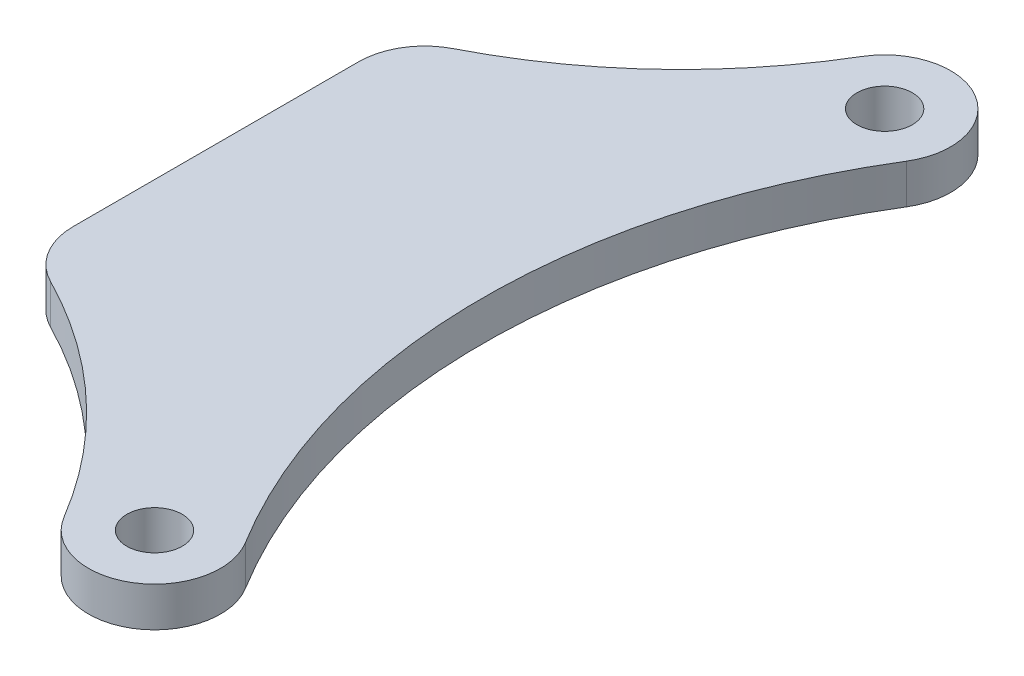
ISO-10303-21;
HEADER;
FILE_DESCRIPTION(('STEP AP214'),'2;1');
FILE_NAME('part.step','',(''),(''),'','','');
FILE_SCHEMA(('AUTOMOTIVE_DESIGN { 1 0 10303 214 1 1 1 1 }'));
ENDSEC;
DATA;
#1=APPLICATION_CONTEXT('core data for automotive mechanical design processes');
#2=APPLICATION_PROTOCOL_DEFINITION('international standard','automotive_design',2000,#1);
#3=PRODUCT_CONTEXT('',#1,'mechanical');
#4=PRODUCT('Part','Part','',(#3));
#5=PRODUCT_RELATED_PRODUCT_CATEGORY('part','',(#4));
#6=PRODUCT_DEFINITION_FORMATION('','',#4);
#7=PRODUCT_DEFINITION_CONTEXT('part definition',#1,'design');
#8=PRODUCT_DEFINITION('design','',#6,#7);
#9=PRODUCT_DEFINITION_SHAPE('','',#8);
#10=(LENGTH_UNIT() NAMED_UNIT(*) SI_UNIT(.MILLI.,.METRE.));
#11=(NAMED_UNIT(*) PLANE_ANGLE_UNIT() SI_UNIT($,.RADIAN.));
#12=(NAMED_UNIT(*) SI_UNIT($,.STERADIAN.) SOLID_ANGLE_UNIT());
#13=UNCERTAINTY_MEASURE_WITH_UNIT(LENGTH_MEASURE(1.E-05),#10,'distance_accuracy_value','');
#14=(GEOMETRIC_REPRESENTATION_CONTEXT(3) GLOBAL_UNCERTAINTY_ASSIGNED_CONTEXT((#13)) GLOBAL_UNIT_ASSIGNED_CONTEXT((#10,
#11,#12)) REPRESENTATION_CONTEXT('',''));
#15=CARTESIAN_POINT('',(0.,0.,0.));
#16=DIRECTION('',(0.,0.,1.));
#17=DIRECTION('',(1.,0.,0.));
#18=AXIS2_PLACEMENT_3D('',#15,#16,#17);
#19=CARTESIAN_POINT('',(-15.081183554011,3.,50.304084356289));
#20=DIRECTION('',(0.,-1.,0.));
#21=DIRECTION('',(0.,0.,-1.));
#22=AXIS2_PLACEMENT_3D('',#19,#20,#21);
#23=CYLINDRICAL_SURFACE('',#22,39.3119401497601);
#24=CARTESIAN_POINT('',(-15.081183554011,3.,50.304084356289));
#25=DIRECTION('',(0.,1.,0.));
#26=DIRECTION('',(0.,0.,1.));
#27=AXIS2_PLACEMENT_3D('',#24,#25,#26);
#28=CIRCLE('',#27,39.3119401497601);
#29=CARTESIAN_POINT('',(18.7030561711687,3.,30.2029952183864));
#30=VERTEX_POINT('',#29);
#31=CARTESIAN_POINT('',(2.73411145098329,3.,15.2606270179591));
#32=VERTEX_POINT('',#31);
#33=EDGE_CURVE('E112',#30,#32,#28,.T.);
#34=ORIENTED_EDGE('',*,*,#33,.T.);
#35=DIRECTION('',(0.,-1.,0.));
#36=VECTOR('',#35,1.);
#37=CARTESIAN_POINT('',(2.73411145098329,3.,15.2606270179591));
#38=LINE('',#37,#36);
#39=CARTESIAN_POINT('',(2.73411145098329,0.,15.2606270179591));
#40=VERTEX_POINT('',#39);
#41=EDGE_CURVE('E11',#32,#40,#38,.T.);
#42=ORIENTED_EDGE('',*,*,#41,.T.);
#43=CARTESIAN_POINT('',(-15.081183554011,0.,50.304084356289));
#44=DIRECTION('',(0.,1.,0.));
#45=DIRECTION('',(0.,0.,1.));
#46=AXIS2_PLACEMENT_3D('',#43,#44,#45);
#47=CIRCLE('',#46,39.3119401497601);
#48=CARTESIAN_POINT('',(18.7030561711687,0.,30.2029952183864));
#49=VERTEX_POINT('',#48);
#50=EDGE_CURVE('E115',#49,#40,#47,.T.);
#51=ORIENTED_EDGE('',*,*,#50,.F.);
#52=DIRECTION('',(0.,-1.,0.));
#53=VECTOR('',#52,1.);
#54=CARTESIAN_POINT('',(18.7030561711687,3.,30.2029952183864));
#55=LINE('',#54,#53);
#56=EDGE_CURVE('E110',#30,#49,#55,.T.);
#57=ORIENTED_EDGE('',*,*,#56,.F.);
#58=EDGE_LOOP('',(#34,#42,#51,#57));
#59=FACE_BOUND('',#58,.T.);
#60=ADVANCED_FACE('F41',(#59),#23,.F.);
#61=CARTESIAN_POINT('',(23.,3.,27.6463814947534));
#62=DIRECTION('',(0.,-1.,0.));
#63=DIRECTION('',(0.,0.,-1.));
#64=AXIS2_PLACEMENT_3D('',#61,#62,#63);
#65=CYLINDRICAL_SURFACE('',#64,4.99999999999999);
#66=CARTESIAN_POINT('',(23.,0.,27.6463814947534));
#67=DIRECTION('',(0.,1.,0.));
#68=DIRECTION('',(0.,0.,1.));
#69=AXIS2_PLACEMENT_3D('',#66,#67,#68);
#70=CIRCLE('',#69,4.99999999999999);
#71=CARTESIAN_POINT('',(27.2602311164125,0.,25.0290487236388));
#72=VERTEX_POINT('',#71);
#73=EDGE_CURVE('E163',#49,#72,#70,.T.);
#74=ORIENTED_EDGE('',*,*,#73,.T.);
#75=DIRECTION('',(0.,-1.,0.));
#76=VECTOR('',#75,1.);
#77=CARTESIAN_POINT('',(27.2602311164125,3.,25.0290487236388));
#78=LINE('',#77,#76);
#79=CARTESIAN_POINT('',(27.2602311164125,3.,25.0290487236388));
#80=VERTEX_POINT('',#79);
#81=EDGE_CURVE('E120',#80,#72,#78,.T.);
#82=ORIENTED_EDGE('',*,*,#81,.F.);
#83=CARTESIAN_POINT('',(23.,3.,27.6463814947534));
#84=DIRECTION('',(0.,1.,0.));
#85=DIRECTION('',(0.,0.,1.));
#86=AXIS2_PLACEMENT_3D('',#83,#84,#85);
#87=CIRCLE('',#86,4.99999999999999);
#88=EDGE_CURVE('E123',#30,#80,#87,.T.);
#89=ORIENTED_EDGE('',*,*,#88,.F.);
#90=ORIENTED_EDGE('',*,*,#56,.T.);
#91=EDGE_LOOP('',(#74,#82,#89,#90));
#92=FACE_BOUND('',#91,.T.);
#93=ADVANCED_FACE('F124',(#92),#65,.T.);
#94=CARTESIAN_POINT('',(68.,3.,0.));
#95=DIRECTION('',(0.,-1.,0.));
#96=DIRECTION('',(0.,0.,-1.));
#97=AXIS2_PLACEMENT_3D('',#94,#95,#96);
#98=CYLINDRICAL_SURFACE('',#97,47.8140361055037);
#99=CARTESIAN_POINT('',(68.,0.,0.));
#100=DIRECTION('',(0.,1.,0.));
#101=DIRECTION('',(0.,0.,1.));
#102=AXIS2_PLACEMENT_3D('',#99,#100,#101);
#103=CIRCLE('',#102,47.8140361055037);
#104=CARTESIAN_POINT('',(27.2602311164125,0.,-25.0290487236388));
#105=VERTEX_POINT('',#104);
#106=EDGE_CURVE('E166',#72,#105,#103,.F.);
#107=ORIENTED_EDGE('',*,*,#106,.T.);
#108=DIRECTION('',(0.,-1.,0.));
#109=VECTOR('',#108,1.);
#110=CARTESIAN_POINT('',(27.2602311164125,3.,-25.0290487236388));
#111=LINE('',#110,#109);
#112=CARTESIAN_POINT('',(27.2602311164125,3.,-25.0290487236388));
#113=VERTEX_POINT('',#112);
#114=EDGE_CURVE('E185',#113,#105,#111,.T.);
#115=ORIENTED_EDGE('',*,*,#114,.F.);
#116=CARTESIAN_POINT('',(68.,3.,0.));
#117=DIRECTION('',(0.,1.,0.));
#118=DIRECTION('',(0.,0.,1.));
#119=AXIS2_PLACEMENT_3D('',#116,#117,#118);
#120=CIRCLE('',#119,47.8140361055037);
#121=EDGE_CURVE('E128',#80,#113,#120,.F.);
#122=ORIENTED_EDGE('',*,*,#121,.F.);
#123=ORIENTED_EDGE('',*,*,#81,.T.);
#124=EDGE_LOOP('',(#107,#115,#122,#123));
#125=FACE_BOUND('',#124,.T.);
#126=ADVANCED_FACE('F228',(#125),#98,.F.);
#127=CARTESIAN_POINT('',(23.,3.,-27.6463814947534));
#128=DIRECTION('',(0.,-1.,0.));
#129=DIRECTION('',(0.,0.,-1.));
#130=AXIS2_PLACEMENT_3D('',#127,#128,#129);
#131=CYLINDRICAL_SURFACE('',#130,4.99999999999999);
#132=CARTESIAN_POINT('',(23.,0.,-27.6463814947534));
#133=DIRECTION('',(0.,1.,0.));
#134=DIRECTION('',(0.,0.,1.));
#135=AXIS2_PLACEMENT_3D('',#132,#133,#134);
#136=CIRCLE('',#135,4.99999999999999);
#137=CARTESIAN_POINT('',(18.7030561711687,0.,-30.2029952183864));
#138=VERTEX_POINT('',#137);
#139=EDGE_CURVE('E169',#105,#138,#136,.T.);
#140=ORIENTED_EDGE('',*,*,#139,.T.);
#141=DIRECTION('',(0.,-1.,0.));
#142=VECTOR('',#141,1.);
#143=CARTESIAN_POINT('',(18.7030561711687,3.,-30.2029952183864));
#144=LINE('',#143,#142);
#145=CARTESIAN_POINT('',(18.7030561711687,3.,-30.2029952183864));
#146=VERTEX_POINT('',#145);
#147=EDGE_CURVE('E160',#146,#138,#144,.T.);
#148=ORIENTED_EDGE('',*,*,#147,.F.);
#149=CARTESIAN_POINT('',(23.,3.,-27.6463814947534));
#150=DIRECTION('',(0.,1.,0.));
#151=DIRECTION('',(0.,0.,1.));
#152=AXIS2_PLACEMENT_3D('',#149,#150,#151);
#153=CIRCLE('',#152,4.99999999999999);
#154=EDGE_CURVE('E142',#113,#146,#153,.T.);
#155=ORIENTED_EDGE('',*,*,#154,.F.);
#156=ORIENTED_EDGE('',*,*,#114,.T.);
#157=EDGE_LOOP('',(#140,#148,#155,#156));
#158=FACE_BOUND('',#157,.T.);
#159=ADVANCED_FACE('F224',(#158),#131,.T.);
#160=CARTESIAN_POINT('',(-15.081183554011,3.,-50.3040843562889));
#161=DIRECTION('',(0.,-1.,0.));
#162=DIRECTION('',(0.,0.,-1.));
#163=AXIS2_PLACEMENT_3D('',#160,#161,#162);
#164=CYLINDRICAL_SURFACE('',#163,39.31194014976);
#165=CARTESIAN_POINT('',(-15.081183554011,0.,-50.3040843562889));
#166=DIRECTION('',(0.,1.,0.));
#167=DIRECTION('',(0.,0.,1.));
#168=AXIS2_PLACEMENT_3D('',#165,#166,#167);
#169=CIRCLE('',#168,39.31194014976);
#170=CARTESIAN_POINT('',(2.73411145098329,0.,-15.2606270179591));
#171=VERTEX_POINT('',#170);
#172=EDGE_CURVE('E172',#138,#171,#169,.F.);
#173=ORIENTED_EDGE('',*,*,#172,.T.);
#174=DIRECTION('',(0.,-1.,0.));
#175=VECTOR('',#174,1.);
#176=CARTESIAN_POINT('',(2.73411145098329,3.,-15.2606270179591));
#177=LINE('',#176,#175);
#178=CARTESIAN_POINT('',(2.73411145098329,3.,-15.2606270179591));
#179=VERTEX_POINT('',#178);
#180=EDGE_CURVE('E65',#171,#179,#177,.F.);
#181=ORIENTED_EDGE('',*,*,#180,.T.);
#182=CARTESIAN_POINT('',(-15.081183554011,3.,-50.3040843562889));
#183=DIRECTION('',(0.,1.,0.));
#184=DIRECTION('',(0.,0.,1.));
#185=AXIS2_PLACEMENT_3D('',#182,#183,#184);
#186=CIRCLE('',#185,39.31194014976);
#187=EDGE_CURVE('E145',#146,#179,#186,.F.);
#188=ORIENTED_EDGE('',*,*,#187,.F.);
#189=ORIENTED_EDGE('',*,*,#147,.T.);
#190=EDGE_LOOP('',(#173,#181,#188,#189));
#191=FACE_BOUND('',#190,.T.);
#192=ADVANCED_FACE('F220',(#191),#164,.F.);
#193=CARTESIAN_POINT('',(23.,3.,-27.6463814947534));
#194=DIRECTION('',(0.,-1.,0.));
#195=DIRECTION('',(0.,0.,-1.));
#196=AXIS2_PLACEMENT_3D('',#193,#194,#195);
#197=CYLINDRICAL_SURFACE('',#196,2.09999999999999);
#198=CARTESIAN_POINT('',(23.,3.,-27.6463814947534));
#199=DIRECTION('',(0.,1.,0.));
#200=DIRECTION('',(0.,0.,1.));
#201=AXIS2_PLACEMENT_3D('',#198,#199,#200);
#202=CIRCLE('',#201,2.09999999999999);
#203=CARTESIAN_POINT('',(23.,3.,-25.5463814947535));
#204=VERTEX_POINT('',#203);
#205=EDGE_CURVE('E152',#204,#204,#202,.T.);
#206=ORIENTED_EDGE('',*,*,#205,.T.);
#207=EDGE_LOOP('',(#206));
#208=FACE_BOUND('',#207,.T.);
#209=CARTESIAN_POINT('',(23.,0.,-27.6463814947534));
#210=DIRECTION('',(0.,1.,0.));
#211=DIRECTION('',(0.,0.,1.));
#212=AXIS2_PLACEMENT_3D('',#209,#210,#211);
#213=CIRCLE('',#212,2.09999999999999);
#214=CARTESIAN_POINT('',(23.,0.,-25.5463814947535));
#215=VERTEX_POINT('',#214);
#216=EDGE_CURVE('E137',#215,#215,#213,.T.);
#217=ORIENTED_EDGE('',*,*,#216,.F.);
#218=EDGE_LOOP('',(#217));
#219=FACE_BOUND('',#218,.T.);
#220=ADVANCED_FACE('F257',(#208,#219),#197,.F.);
#221=CARTESIAN_POINT('',(0.,3.,0.));
#222=DIRECTION('',(-1.,0.,0.));
#223=DIRECTION('',(0.,0.,1.));
#224=AXIS2_PLACEMENT_3D('',#221,#222,#223);
#225=PLANE('',#224);
#226=DIRECTION('',(0.,0.,-1.));
#227=VECTOR('',#226,1.);
#228=CARTESIAN_POINT('',(0.,3.,0.));
#229=LINE('',#228,#227);
#230=CARTESIAN_POINT('',(0.,3.,10.8035260449684));
#231=VERTEX_POINT('',#230);
#232=CARTESIAN_POINT('',(0.,3.,-10.8035260449684));
#233=VERTEX_POINT('',#232);
#234=EDGE_CURVE('E148',#231,#233,#229,.T.);
#235=ORIENTED_EDGE('',*,*,#234,.T.);
#236=DIRECTION('',(0.,1.,0.));
#237=VECTOR('',#236,1.);
#238=CARTESIAN_POINT('',(0.,0.,-10.8035260449684));
#239=LINE('',#238,#237);
#240=CARTESIAN_POINT('',(0.,0.,-10.8035260449684));
#241=VERTEX_POINT('',#240);
#242=EDGE_CURVE('E193',#233,#241,#239,.F.);
#243=ORIENTED_EDGE('',*,*,#242,.T.);
#244=DIRECTION('',(0.,0.,-1.));
#245=VECTOR('',#244,1.);
#246=CARTESIAN_POINT('',(0.,0.,0.));
#247=LINE('',#246,#245);
#248=CARTESIAN_POINT('',(0.,0.,10.8035260449684));
#249=VERTEX_POINT('',#248);
#250=EDGE_CURVE('E175',#249,#241,#247,.T.);
#251=ORIENTED_EDGE('',*,*,#250,.F.);
#252=DIRECTION('',(0.,-1.,0.));
#253=VECTOR('',#252,1.);
#254=CARTESIAN_POINT('',(0.,3.,10.8035260449684));
#255=LINE('',#254,#253);
#256=EDGE_CURVE('E119',#249,#231,#255,.F.);
#257=ORIENTED_EDGE('',*,*,#256,.T.);
#258=EDGE_LOOP('',(#235,#243,#251,#257));
#259=FACE_BOUND('',#258,.T.);
#260=ADVANCED_FACE('F211',(#259),#225,.T.);
#261=CARTESIAN_POINT('',(23.,3.,27.6463814947534));
#262=DIRECTION('',(0.,-1.,0.));
#263=DIRECTION('',(0.,0.,-1.));
#264=AXIS2_PLACEMENT_3D('',#261,#262,#263);
#265=CYLINDRICAL_SURFACE('',#264,2.09999999999999);
#266=CARTESIAN_POINT('',(23.,3.,27.6463814947534));
#267=DIRECTION('',(0.,1.,0.));
#268=DIRECTION('',(0.,0.,1.));
#269=AXIS2_PLACEMENT_3D('',#266,#267,#268);
#270=CIRCLE('',#269,2.09999999999999);
#271=CARTESIAN_POINT('',(23.,3.,29.7463814947534));
#272=VERTEX_POINT('',#271);
#273=EDGE_CURVE('E156',#272,#272,#270,.T.);
#274=ORIENTED_EDGE('',*,*,#273,.T.);
#275=EDGE_LOOP('',(#274));
#276=FACE_BOUND('',#275,.T.);
#277=CARTESIAN_POINT('',(23.,0.,27.6463814947534));
#278=DIRECTION('',(0.,1.,0.));
#279=DIRECTION('',(0.,0.,1.));
#280=AXIS2_PLACEMENT_3D('',#277,#278,#279);
#281=CIRCLE('',#280,2.09999999999999);
#282=CARTESIAN_POINT('',(23.,0.,29.7463814947534));
#283=VERTEX_POINT('',#282);
#284=EDGE_CURVE('E133',#283,#283,#281,.T.);
#285=ORIENTED_EDGE('',*,*,#284,.F.);
#286=EDGE_LOOP('',(#285));
#287=FACE_BOUND('',#286,.T.);
#288=ADVANCED_FACE('F251',(#276,#287),#265,.F.);
#289=CARTESIAN_POINT('',(0.,3.,0.));
#290=DIRECTION('',(0.,1.,0.));
#291=DIRECTION('',(0.,0.,1.));
#292=AXIS2_PLACEMENT_3D('',#289,#290,#291);
#293=PLANE('',#292);
#294=ORIENTED_EDGE('',*,*,#187,.T.);
#295=CARTESIAN_POINT('',(5.,3.,-10.8035260449684));
#296=DIRECTION('',(0.,1.,0.));
#297=DIRECTION('',(0.,0.,1.));
#298=AXIS2_PLACEMENT_3D('',#295,#296,#297);
#299=CIRCLE('',#298,5.);
#300=EDGE_CURVE('E50',#179,#233,#299,.T.);
#301=ORIENTED_EDGE('',*,*,#300,.T.);
#302=ORIENTED_EDGE('',*,*,#234,.F.);
#303=CARTESIAN_POINT('',(5.,3.,10.8035260449684));
#304=DIRECTION('',(0.,1.,0.));
#305=DIRECTION('',(0.,0.,1.));
#306=AXIS2_PLACEMENT_3D('',#303,#304,#305);
#307=CIRCLE('',#306,5.);
#308=EDGE_CURVE('E57',#231,#32,#307,.T.);
#309=ORIENTED_EDGE('',*,*,#308,.T.);
#310=ORIENTED_EDGE('',*,*,#33,.F.);
#311=ORIENTED_EDGE('',*,*,#88,.T.);
#312=ORIENTED_EDGE('',*,*,#121,.T.);
#313=ORIENTED_EDGE('',*,*,#154,.T.);
#314=EDGE_LOOP('',(#294,#301,#302,#309,#310,#311,#312,#313));
#315=FACE_BOUND('',#314,.T.);
#316=ORIENTED_EDGE('',*,*,#205,.F.);
#317=EDGE_LOOP('',(#316));
#318=FACE_BOUND('',#317,.T.);
#319=ORIENTED_EDGE('',*,*,#273,.F.);
#320=EDGE_LOOP('',(#319));
#321=FACE_BOUND('',#320,.T.);
#322=ADVANCED_FACE('F130',(#315,#318,#321),#293,.T.);
#323=CARTESIAN_POINT('',(0.,0.,0.));
#324=DIRECTION('',(0.,1.,0.));
#325=DIRECTION('',(0.,0.,1.));
#326=AXIS2_PLACEMENT_3D('',#323,#324,#325);
#327=PLANE('',#326);
#328=ORIENTED_EDGE('',*,*,#250,.T.);
#329=CARTESIAN_POINT('',(5.,0.,-10.8035260449684));
#330=DIRECTION('',(0.,1.,0.));
#331=DIRECTION('',(0.,0.,1.));
#332=AXIS2_PLACEMENT_3D('',#329,#330,#331);
#333=CIRCLE('',#332,5.);
#334=EDGE_CURVE('E200',#241,#171,#333,.F.);
#335=ORIENTED_EDGE('',*,*,#334,.T.);
#336=ORIENTED_EDGE('',*,*,#172,.F.);
#337=ORIENTED_EDGE('',*,*,#139,.F.);
#338=ORIENTED_EDGE('',*,*,#106,.F.);
#339=ORIENTED_EDGE('',*,*,#73,.F.);
#340=ORIENTED_EDGE('',*,*,#50,.T.);
#341=CARTESIAN_POINT('',(5.,0.,10.8035260449684));
#342=DIRECTION('',(0.,1.,0.));
#343=DIRECTION('',(0.,0.,1.));
#344=AXIS2_PLACEMENT_3D('',#341,#342,#343);
#345=CIRCLE('',#344,5.);
#346=EDGE_CURVE('E197',#40,#249,#345,.F.);
#347=ORIENTED_EDGE('',*,*,#346,.T.);
#348=EDGE_LOOP('',(#328,#335,#336,#337,#338,#339,#340,#347));
#349=FACE_BOUND('',#348,.T.);
#350=ORIENTED_EDGE('',*,*,#216,.T.);
#351=EDGE_LOOP('',(#350));
#352=FACE_BOUND('',#351,.T.);
#353=ORIENTED_EDGE('',*,*,#284,.T.);
#354=EDGE_LOOP('',(#353));
#355=FACE_BOUND('',#354,.T.);
#356=ADVANCED_FACE('F217',(#349,#352,#355),#327,.F.);
#357=CARTESIAN_POINT('',(5.,3.,-10.8035260449684));
#358=DIRECTION('',(0.,-1.,0.));
#359=DIRECTION('',(0.,0.,-1.));
#360=AXIS2_PLACEMENT_3D('',#357,#358,#359);
#361=CYLINDRICAL_SURFACE('',#360,5.);
#362=ORIENTED_EDGE('',*,*,#300,.F.);
#363=ORIENTED_EDGE('',*,*,#180,.F.);
#364=ORIENTED_EDGE('',*,*,#334,.F.);
#365=ORIENTED_EDGE('',*,*,#242,.F.);
#366=EDGE_LOOP('',(#362,#363,#364,#365));
#367=FACE_BOUND('',#366,.T.);
#368=ADVANCED_FACE('F214',(#367),#361,.T.);
#369=CARTESIAN_POINT('',(5.,3.,10.8035260449684));
#370=DIRECTION('',(0.,-1.,0.));
#371=DIRECTION('',(0.,0.,-1.));
#372=AXIS2_PLACEMENT_3D('',#369,#370,#371);
#373=CYLINDRICAL_SURFACE('',#372,5.);
#374=ORIENTED_EDGE('',*,*,#308,.F.);
#375=ORIENTED_EDGE('',*,*,#256,.F.);
#376=ORIENTED_EDGE('',*,*,#346,.F.);
#377=ORIENTED_EDGE('',*,*,#41,.F.);
#378=EDGE_LOOP('',(#374,#375,#376,#377));
#379=FACE_BOUND('',#378,.T.);
#380=ADVANCED_FACE('F43',(#379),#373,.T.);
#381=CLOSED_SHELL('',(#60,#93,#126,#159,#192,#220,#260,#288,#322,#356,#368,#380));
#382=MANIFOLD_SOLID_BREP('B2',#381);
#383=ADVANCED_BREP_SHAPE_REPRESENTATION('',(#18,#382),#14);
#384=SHAPE_DEFINITION_REPRESENTATION(#9,#383);
ENDSEC;
END-ISO-10303-21;
